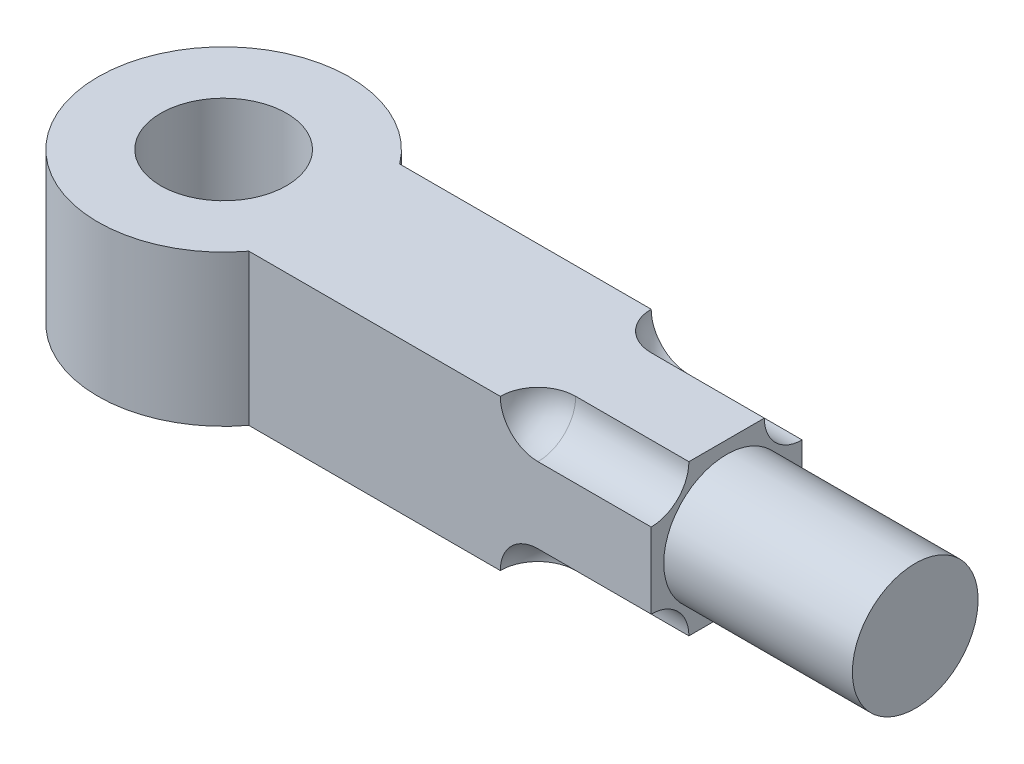
ISO-10303-21;
HEADER;
FILE_DESCRIPTION(('STEP AP214'),'2;1');
FILE_NAME('part.step','',(''),(''),'','','');
FILE_SCHEMA(('AUTOMOTIVE_DESIGN { 1 0 10303 214 1 1 1 1 }'));
ENDSEC;
DATA;
#1=APPLICATION_CONTEXT('core data for automotive mechanical design processes');
#2=APPLICATION_PROTOCOL_DEFINITION('international standard','automotive_design',2000,#1);
#3=PRODUCT_CONTEXT('',#1,'mechanical');
#4=PRODUCT('Part','Part','',(#3));
#5=PRODUCT_RELATED_PRODUCT_CATEGORY('part','',(#4));
#6=PRODUCT_DEFINITION_FORMATION('','',#4);
#7=PRODUCT_DEFINITION_CONTEXT('part definition',#1,'design');
#8=PRODUCT_DEFINITION('design','',#6,#7);
#9=PRODUCT_DEFINITION_SHAPE('','',#8);
#10=(LENGTH_UNIT() NAMED_UNIT(*) SI_UNIT(.MILLI.,.METRE.));
#11=(NAMED_UNIT(*) PLANE_ANGLE_UNIT() SI_UNIT($,.RADIAN.));
#12=(NAMED_UNIT(*) SI_UNIT($,.STERADIAN.) SOLID_ANGLE_UNIT());
#13=UNCERTAINTY_MEASURE_WITH_UNIT(LENGTH_MEASURE(1.E-05),#10,'distance_accuracy_value','');
#14=(GEOMETRIC_REPRESENTATION_CONTEXT(3) GLOBAL_UNCERTAINTY_ASSIGNED_CONTEXT((#13)) GLOBAL_UNIT_ASSIGNED_CONTEXT((#10,
#11,#12)) REPRESENTATION_CONTEXT('',''));
#15=CARTESIAN_POINT('',(0.,0.,0.));
#16=DIRECTION('',(0.,0.,1.));
#17=DIRECTION('',(1.,0.,0.));
#18=AXIS2_PLACEMENT_3D('',#15,#16,#17);
#19=CARTESIAN_POINT('',(-24.0000000000012,24.,11.9999999999971));
#20=DIRECTION('',(0.,0.,-0.999999999999995));
#21=DIRECTION('',(-0.999999999999995,0.,0.));
#22=AXIS2_PLACEMENT_3D('',#19,#20,#21);
#23=PLANE('',#22);
#24=DIRECTION('',(-0.999999999999995,0.,0.));
#25=VECTOR('',#24,1.);
#26=CARTESIAN_POINT('',(69.9999999999989,6.00000000000001,11.9999999999989));
#27=LINE('',#26,#25);
#28=CARTESIAN_POINT('',(40.0000000000001,6.00000000000001,11.9999999999891));
#29=VERTEX_POINT('',#28);
#30=CARTESIAN_POINT('',(21.9999999999992,6.00000000000001,12.0000000000087));
#31=VERTEX_POINT('',#30);
#32=EDGE_CURVE('E423',#29,#31,#27,.T.);
#33=ORIENTED_EDGE('',*,*,#32,.F.);
#34=DIRECTION('',(0.,-1.,0.));
#35=VECTOR('',#34,1.);
#36=CARTESIAN_POINT('',(40.0000000000001,24.,11.9999999999891));
#37=LINE('',#36,#35);
#38=CARTESIAN_POINT('',(40.0000000000001,18.,11.9999999999891));
#39=VERTEX_POINT('',#38);
#40=EDGE_CURVE('E379',#39,#29,#37,.T.);
#41=ORIENTED_EDGE('',*,*,#40,.F.);
#42=DIRECTION('',(-0.999999999999995,0.,0.));
#43=VECTOR('',#42,1.);
#44=CARTESIAN_POINT('',(69.9999999999989,18.,11.9999999999989));
#45=LINE('',#44,#43);
#46=CARTESIAN_POINT('',(21.9999999999992,18.,12.0000000000087));
#47=VERTEX_POINT('',#46);
#48=EDGE_CURVE('E418',#47,#39,#45,.F.);
#49=ORIENTED_EDGE('',*,*,#48,.F.);
#50=CARTESIAN_POINT('',(21.9999999999992,24.,12.0000000000087));
#51=DIRECTION('',(0.,0.,-0.999999999999995));
#52=DIRECTION('',(-0.999999999999995,0.,0.));
#53=AXIS2_PLACEMENT_3D('',#50,#51,#52);
#54=CIRCLE('',#53,6.);
#55=CARTESIAN_POINT('',(15.9999999999961,24.,11.9999999999956));
#56=VERTEX_POINT('',#55);
#57=EDGE_CURVE('E12',#47,#56,#54,.T.);
#58=ORIENTED_EDGE('',*,*,#57,.T.);
#59=DIRECTION('',(0.999999999999995,0.,0.));
#60=VECTOR('',#59,1.);
#61=CARTESIAN_POINT('',(-24.0000000000012,24.,11.9999999999971));
#62=LINE('',#61,#60);
#63=CARTESIAN_POINT('',(-24.0000000000012,24.,11.9999999999971));
#64=VERTEX_POINT('',#63);
#65=EDGE_CURVE('E387',#64,#56,#62,.T.);
#66=ORIENTED_EDGE('',*,*,#65,.F.);
#67=DIRECTION('',(0.,-1.,0.));
#68=VECTOR('',#67,1.);
#69=CARTESIAN_POINT('',(-24.0000000000012,24.,11.9999999999971));
#70=LINE('',#69,#68);
#71=CARTESIAN_POINT('',(-24.0000000000012,0.,11.9999999999971));
#72=VERTEX_POINT('',#71);
#73=EDGE_CURVE('E374',#64,#72,#70,.T.);
#74=ORIENTED_EDGE('',*,*,#73,.T.);
#75=DIRECTION('',(0.999999999999995,0.,0.));
#76=VECTOR('',#75,1.);
#77=CARTESIAN_POINT('',(-24.0000000000012,0.,11.9999999999971));
#78=LINE('',#77,#76);
#79=CARTESIAN_POINT('',(15.9999999999961,0.,11.9999999999956));
#80=VERTEX_POINT('',#79);
#81=EDGE_CURVE('E391',#72,#80,#78,.T.);
#82=ORIENTED_EDGE('',*,*,#81,.T.);
#83=CARTESIAN_POINT('',(21.9999999999992,0.,12.0000000000087));
#84=DIRECTION('',(0.,0.,-0.999999999999995));
#85=DIRECTION('',(-0.999999999999995,0.,0.));
#86=AXIS2_PLACEMENT_3D('',#83,#84,#85);
#87=CIRCLE('',#86,6.);
#88=EDGE_CURVE('E148',#80,#31,#87,.T.);
#89=ORIENTED_EDGE('',*,*,#88,.T.);
#90=EDGE_LOOP('',(#33,#41,#49,#58,#66,#74,#82,#89));
#91=FACE_BOUND('',#90,.T.);
#92=ADVANCED_FACE('F51',(#91),#23,.F.);
#93=CARTESIAN_POINT('',(-24.,24.,-11.9999999999998));
#94=DIRECTION('',(0.,0.,-0.999999999999995));
#95=DIRECTION('',(-0.999999999999995,0.,0.));
#96=AXIS2_PLACEMENT_3D('',#93,#94,#95);
#97=PLANE('',#96);
#98=DIRECTION('',(0.,-1.,0.));
#99=VECTOR('',#98,1.);
#100=CARTESIAN_POINT('',(39.9999999999972,24.,-11.9999999999978));
#101=LINE('',#100,#99);
#102=CARTESIAN_POINT('',(39.9999999999972,18.0000000000001,-11.9999999999978));
#103=VERTEX_POINT('',#102);
#104=CARTESIAN_POINT('',(39.9999999999972,5.99999999999989,-11.9999999999978));
#105=VERTEX_POINT('',#104);
#106=EDGE_CURVE('E401',#103,#105,#101,.T.);
#107=ORIENTED_EDGE('',*,*,#106,.T.);
#108=DIRECTION('',(-0.999999999999995,0.,0.));
#109=VECTOR('',#108,1.);
#110=CARTESIAN_POINT('',(69.9999999999986,5.99999999999989,-12.0000000000025));
#111=LINE('',#110,#109);
#112=CARTESIAN_POINT('',(22.0000000000005,5.99999999999989,-12.0000000000011));
#113=VERTEX_POINT('',#112);
#114=EDGE_CURVE('E144',#105,#113,#111,.T.);
#115=ORIENTED_EDGE('',*,*,#114,.T.);
#116=CARTESIAN_POINT('',(22.0000000000005,-1.11022302462516E-13,-12.0000000000011));
#117=DIRECTION('',(0.,0.,-0.999999999999995));
#118=DIRECTION('',(-0.999999999999995,0.,0.));
#119=AXIS2_PLACEMENT_3D('',#116,#117,#118);
#120=CIRCLE('',#119,6.);
#121=CARTESIAN_POINT('',(16.0000000000015,0.,-12.0000000000011));
#122=VERTEX_POINT('',#121);
#123=EDGE_CURVE('E140',#113,#122,#120,.F.);
#124=ORIENTED_EDGE('',*,*,#123,.T.);
#125=DIRECTION('',(0.999999999999995,0.,0.));
#126=VECTOR('',#125,1.);
#127=CARTESIAN_POINT('',(-24.,0.,-11.9999999999998));
#128=LINE('',#127,#126);
#129=CARTESIAN_POINT('',(-24.,0.,-11.9999999999998));
#130=VERTEX_POINT('',#129);
#131=EDGE_CURVE('E141',#130,#122,#128,.T.);
#132=ORIENTED_EDGE('',*,*,#131,.F.);
#133=DIRECTION('',(0.,-1.,0.));
#134=VECTOR('',#133,1.);
#135=CARTESIAN_POINT('',(-24.,24.,-11.9999999999998));
#136=LINE('',#135,#134);
#137=CARTESIAN_POINT('',(-24.,24.,-11.9999999999998));
#138=VERTEX_POINT('',#137);
#139=EDGE_CURVE('E210',#138,#130,#136,.T.);
#140=ORIENTED_EDGE('',*,*,#139,.F.);
#141=DIRECTION('',(0.999999999999995,0.,0.));
#142=VECTOR('',#141,1.);
#143=CARTESIAN_POINT('',(-24.,24.,-11.9999999999998));
#144=LINE('',#143,#142);
#145=CARTESIAN_POINT('',(16.0000000000015,24.,-12.0000000000011));
#146=VERTEX_POINT('',#145);
#147=EDGE_CURVE('E198',#138,#146,#144,.T.);
#148=ORIENTED_EDGE('',*,*,#147,.T.);
#149=CARTESIAN_POINT('',(22.0000000000005,24.0000000000001,-12.0000000000011));
#150=DIRECTION('',(0.,0.,-0.999999999999995));
#151=DIRECTION('',(-0.999999999999995,0.,0.));
#152=AXIS2_PLACEMENT_3D('',#149,#150,#151);
#153=CIRCLE('',#152,6.);
#154=CARTESIAN_POINT('',(22.0000000000005,18.0000000000001,-12.0000000000011));
#155=VERTEX_POINT('',#154);
#156=EDGE_CURVE('E181',#146,#155,#153,.F.);
#157=ORIENTED_EDGE('',*,*,#156,.T.);
#158=DIRECTION('',(-0.999999999999995,0.,0.));
#159=VECTOR('',#158,1.);
#160=CARTESIAN_POINT('',(69.9999999999986,18.0000000000001,-12.0000000000025));
#161=LINE('',#160,#159);
#162=EDGE_CURVE('E437',#155,#103,#161,.F.);
#163=ORIENTED_EDGE('',*,*,#162,.T.);
#164=EDGE_LOOP('',(#107,#115,#124,#132,#140,#148,#157,#163));
#165=FACE_BOUND('',#164,.T.);
#166=ADVANCED_FACE('F145',(#165),#97,.T.);
#167=CARTESIAN_POINT('',(-39.9999999999973,24.,3.5527136788005E-12));
#168=DIRECTION('',(0.,1.,0.));
#169=DIRECTION('',(0.,0.,0.999999999999995));
#170=AXIS2_PLACEMENT_3D('',#167,#168,#169);
#171=PLANE('',#170);
#172=CARTESIAN_POINT('',(-39.9999999999973,24.000012,3.5527136788005E-12));
#173=DIRECTION('',(0.,1.,0.));
#174=DIRECTION('',(0.,0.,1.));
#175=AXIS2_PLACEMENT_3D('',#172,#173,#174);
#176=CIRCLE('',#175,9.99999999999995);
#177=CARTESIAN_POINT('',(-39.9999999999973,24.000012,10.0000000000035));
#178=VERTEX_POINT('',#177);
#179=EDGE_CURVE('E445',#178,#178,#176,.T.);
#180=ORIENTED_EDGE('',*,*,#179,.F.);
#181=EDGE_LOOP('',(#180));
#182=FACE_BOUND('',#181,.T.);
#183=DIRECTION('',(0.,0.,0.999999999999995));
#184=VECTOR('',#183,1.);
#185=CARTESIAN_POINT('',(39.9999999999972,24.,-11.9999999999978));
#186=LINE('',#185,#184);
#187=CARTESIAN_POINT('',(39.9999999999976,24.,-6.00000000000711));
#188=VERTEX_POINT('',#187);
#189=CARTESIAN_POINT('',(40.,24.,6.00000000000001));
#190=VERTEX_POINT('',#189);
#191=EDGE_CURVE('E208',#188,#190,#186,.T.);
#192=ORIENTED_EDGE('',*,*,#191,.F.);
#193=DIRECTION('',(-0.999999999999995,0.,0.));
#194=VECTOR('',#193,1.);
#195=CARTESIAN_POINT('',(69.9999999999984,24.,-6.00000000000001));
#196=LINE('',#195,#194);
#197=CARTESIAN_POINT('',(21.9999999999999,24.,-6.00000000000001));
#198=VERTEX_POINT('',#197);
#199=EDGE_CURVE('E203',#188,#198,#196,.T.);
#200=ORIENTED_EDGE('',*,*,#199,.T.);
#201=CARTESIAN_POINT('',(22.0000000000006,24.,-12.0000000000009));
#202=DIRECTION('',(0.,1.,0.));
#203=DIRECTION('',(0.,0.,0.999999999999995));
#204=AXIS2_PLACEMENT_3D('',#201,#202,#203);
#205=CIRCLE('',#204,6.);
#206=EDGE_CURVE('E183',#198,#146,#205,.F.);
#207=ORIENTED_EDGE('',*,*,#206,.T.);
#208=ORIENTED_EDGE('',*,*,#147,.F.);
#209=CARTESIAN_POINT('',(-39.9999999999973,24.,3.5527136788005E-12));
#210=DIRECTION('',(0.,1.,0.));
#211=DIRECTION('',(0.,0.,0.999999999999995));
#212=AXIS2_PLACEMENT_3D('',#209,#210,#211);
#213=CIRCLE('',#212,20.);
#214=EDGE_CURVE('E162',#138,#64,#213,.T.);
#215=ORIENTED_EDGE('',*,*,#214,.T.);
#216=ORIENTED_EDGE('',*,*,#65,.T.);
#217=CARTESIAN_POINT('',(21.9999999999992,24.,12.0000000000087));
#218=DIRECTION('',(0.,1.,0.));
#219=DIRECTION('',(0.,0.,0.999999999999995));
#220=AXIS2_PLACEMENT_3D('',#217,#218,#219);
#221=CIRCLE('',#220,6.);
#222=CARTESIAN_POINT('',(22.,24.,6.00000000000001));
#223=VERTEX_POINT('',#222);
#224=EDGE_CURVE('E58',#56,#223,#221,.F.);
#225=ORIENTED_EDGE('',*,*,#224,.T.);
#226=DIRECTION('',(-0.999999999999995,0.,0.));
#227=VECTOR('',#226,1.);
#228=CARTESIAN_POINT('',(69.9999999999984,24.,6.00000000000001));
#229=LINE('',#228,#227);
#230=EDGE_CURVE('E224',#223,#190,#229,.F.);
#231=ORIENTED_EDGE('',*,*,#230,.T.);
#232=EDGE_LOOP('',(#192,#200,#207,#208,#215,#216,#225,#231));
#233=FACE_BOUND('',#232,.T.);
#234=ADVANCED_FACE('F199',(#182,#233),#171,.T.);
#235=CARTESIAN_POINT('',(-39.9999999999973,0.,3.5527136788005E-12));
#236=DIRECTION('',(0.,1.,0.));
#237=DIRECTION('',(0.,0.,0.999999999999995));
#238=AXIS2_PLACEMENT_3D('',#235,#236,#237);
#239=PLANE('',#238);
#240=CARTESIAN_POINT('',(-39.9999999999973,0.,3.5527136788005E-12));
#241=DIRECTION('',(0.,1.,0.));
#242=DIRECTION('',(0.,0.,0.999999999999995));
#243=AXIS2_PLACEMENT_3D('',#240,#241,#242);
#244=CIRCLE('',#243,10.);
#245=CARTESIAN_POINT('',(-39.9999999999973,0.,10.0000000000035));
#246=VERTEX_POINT('',#245);
#247=EDGE_CURVE('E442',#246,#246,#244,.T.);
#248=ORIENTED_EDGE('',*,*,#247,.T.);
#249=EDGE_LOOP('',(#248));
#250=FACE_BOUND('',#249,.T.);
#251=DIRECTION('',(-0.999999999999995,0.,0.));
#252=VECTOR('',#251,1.);
#253=CARTESIAN_POINT('',(69.9999999999984,0.,6.00000000000001));
#254=LINE('',#253,#252);
#255=CARTESIAN_POINT('',(22.,0.,6.00000000000001));
#256=VERTEX_POINT('',#255);
#257=CARTESIAN_POINT('',(40.,0.,6.00000000000001));
#258=VERTEX_POINT('',#257);
#259=EDGE_CURVE('E226',#256,#258,#254,.F.);
#260=ORIENTED_EDGE('',*,*,#259,.F.);
#261=CARTESIAN_POINT('',(21.9999999999992,0.,12.0000000000087));
#262=DIRECTION('',(0.,1.,0.));
#263=DIRECTION('',(0.,0.,0.999999999999995));
#264=AXIS2_PLACEMENT_3D('',#261,#262,#263);
#265=CIRCLE('',#264,6.);
#266=EDGE_CURVE('E178',#256,#80,#265,.T.);
#267=ORIENTED_EDGE('',*,*,#266,.T.);
#268=ORIENTED_EDGE('',*,*,#81,.F.);
#269=CARTESIAN_POINT('',(-39.9999999999973,0.,3.5527136788005E-12));
#270=DIRECTION('',(0.,1.,0.));
#271=DIRECTION('',(0.,0.,0.999999999999995));
#272=AXIS2_PLACEMENT_3D('',#269,#270,#271);
#273=CIRCLE('',#272,20.);
#274=EDGE_CURVE('E159',#130,#72,#273,.T.);
#275=ORIENTED_EDGE('',*,*,#274,.F.);
#276=ORIENTED_EDGE('',*,*,#131,.T.);
#277=CARTESIAN_POINT('',(22.0000000000006,0.,-12.0000000000009));
#278=DIRECTION('',(0.,1.,0.));
#279=DIRECTION('',(0.,0.,0.999999999999995));
#280=AXIS2_PLACEMENT_3D('',#277,#278,#279);
#281=CIRCLE('',#280,6.);
#282=CARTESIAN_POINT('',(21.9999999999999,0.,-6.00000000000001));
#283=VERTEX_POINT('',#282);
#284=EDGE_CURVE('E152',#122,#283,#281,.T.);
#285=ORIENTED_EDGE('',*,*,#284,.T.);
#286=DIRECTION('',(-0.999999999999995,0.,0.));
#287=VECTOR('',#286,1.);
#288=CARTESIAN_POINT('',(69.9999999999984,0.,-6.00000000000001));
#289=LINE('',#288,#287);
#290=CARTESIAN_POINT('',(39.9999999999976,0.,-6.00000000000711));
#291=VERTEX_POINT('',#290);
#292=EDGE_CURVE('E233',#291,#283,#289,.T.);
#293=ORIENTED_EDGE('',*,*,#292,.F.);
#294=DIRECTION('',(0.,0.,0.999999999999995));
#295=VECTOR('',#294,1.);
#296=CARTESIAN_POINT('',(39.9999999999972,0.,-11.9999999999978));
#297=LINE('',#296,#295);
#298=EDGE_CURVE('E161',#291,#258,#297,.T.);
#299=ORIENTED_EDGE('',*,*,#298,.T.);
#300=EDGE_LOOP('',(#260,#267,#268,#275,#276,#285,#293,#299));
#301=FACE_BOUND('',#300,.T.);
#302=ADVANCED_FACE('F156',(#250,#301),#239,.F.);
#303=CARTESIAN_POINT('',(-39.9999999999973,24.,3.5527136788005E-12));
#304=DIRECTION('',(0.,-1.,0.));
#305=DIRECTION('',(0.,0.,-0.999999999999995));
#306=AXIS2_PLACEMENT_3D('',#303,#304,#305);
#307=CYLINDRICAL_SURFACE('',#306,20.);
#308=ORIENTED_EDGE('',*,*,#274,.T.);
#309=ORIENTED_EDGE('',*,*,#73,.F.);
#310=ORIENTED_EDGE('',*,*,#214,.F.);
#311=ORIENTED_EDGE('',*,*,#139,.T.);
#312=EDGE_LOOP('',(#308,#309,#310,#311));
#313=FACE_BOUND('',#312,.T.);
#314=ADVANCED_FACE('F253',(#313),#307,.T.);
#315=CARTESIAN_POINT('',(39.9999999999972,24.,-11.9999999999978));
#316=DIRECTION('',(0.999999999999995,0.,0.));
#317=DIRECTION('',(0.,0.,-0.999999999999995));
#318=AXIS2_PLACEMENT_3D('',#315,#316,#317);
#319=PLANE('',#318);
#320=CARTESIAN_POINT('',(39.9999999999997,12.,-3.33066907387547E-12));
#321=DIRECTION('',(0.999999999999995,0.,0.));
#322=DIRECTION('',(0.,0.,-0.999999999999995));
#323=AXIS2_PLACEMENT_3D('',#320,#321,#322);
#324=CIRCLE('',#323,10.);
#325=CARTESIAN_POINT('',(39.9999999999997,12.,9.99999999999706));
#326=VERTEX_POINT('',#325);
#327=EDGE_CURVE('E234',#326,#326,#324,.T.);
#328=ORIENTED_EDGE('',*,*,#327,.F.);
#329=EDGE_LOOP('',(#328));
#330=FACE_BOUND('',#329,.T.);
#331=ORIENTED_EDGE('',*,*,#40,.T.);
#332=CARTESIAN_POINT('',(40.0000000000001,0.,11.9999999999891));
#333=DIRECTION('',(0.999999999999995,0.,0.));
#334=DIRECTION('',(0.,0.,-0.999999999999995));
#335=AXIS2_PLACEMENT_3D('',#332,#333,#334);
#336=CIRCLE('',#335,6.);
#337=EDGE_CURVE('E411',#29,#258,#336,.F.);
#338=ORIENTED_EDGE('',*,*,#337,.T.);
#339=ORIENTED_EDGE('',*,*,#298,.F.);
#340=CARTESIAN_POINT('',(39.9999999999972,-1.11022302462516E-13,-11.9999999999978));
#341=DIRECTION('',(0.999999999999995,0.,0.));
#342=DIRECTION('',(0.,0.,-0.999999999999995));
#343=AXIS2_PLACEMENT_3D('',#340,#341,#342);
#344=CIRCLE('',#343,6.);
#345=EDGE_CURVE('E478',#291,#105,#344,.F.);
#346=ORIENTED_EDGE('',*,*,#345,.T.);
#347=ORIENTED_EDGE('',*,*,#106,.F.);
#348=CARTESIAN_POINT('',(39.9999999999972,24.0000000000001,-11.9999999999978));
#349=DIRECTION('',(0.999999999999995,0.,0.));
#350=DIRECTION('',(0.,0.,-0.999999999999995));
#351=AXIS2_PLACEMENT_3D('',#348,#349,#350);
#352=CIRCLE('',#351,6.);
#353=EDGE_CURVE('E434',#103,#188,#352,.F.);
#354=ORIENTED_EDGE('',*,*,#353,.T.);
#355=ORIENTED_EDGE('',*,*,#191,.T.);
#356=CARTESIAN_POINT('',(40.0000000000001,24.,11.9999999999891));
#357=DIRECTION('',(0.999999999999995,0.,0.));
#358=DIRECTION('',(0.,0.,-0.999999999999995));
#359=AXIS2_PLACEMENT_3D('',#356,#357,#358);
#360=CIRCLE('',#359,6.);
#361=EDGE_CURVE('E416',#190,#39,#360,.F.);
#362=ORIENTED_EDGE('',*,*,#361,.T.);
#363=EDGE_LOOP('',(#331,#338,#339,#346,#347,#354,#355,#362));
#364=FACE_BOUND('',#363,.T.);
#365=ADVANCED_FACE('F256',(#330,#364),#319,.T.);
#366=CARTESIAN_POINT('',(69.9999999999991,12.,-2.88657986402541E-12));
#367=DIRECTION('',(-0.999999999999995,0.,0.));
#368=DIRECTION('',(0.,0.,0.999999999999995));
#369=AXIS2_PLACEMENT_3D('',#366,#367,#368);
#370=CYLINDRICAL_SURFACE('',#369,10.);
#371=CARTESIAN_POINT('',(69.9999999999991,12.,-2.88657986402541E-12));
#372=DIRECTION('',(0.999999999999995,0.,0.));
#373=DIRECTION('',(0.,0.,-0.999999999999995));
#374=AXIS2_PLACEMENT_3D('',#371,#372,#373);
#375=CIRCLE('',#374,10.);
#376=CARTESIAN_POINT('',(69.9999999999991,12.,9.99999999999706));
#377=VERTEX_POINT('',#376);
#378=EDGE_CURVE('E371',#377,#377,#375,.T.);
#379=CARTESIAN_POINT('',(69.9999999999991,12.,9.99999999999706));
#380=CARTESIAN_POINT('',(69.6874999999991,12.,9.99999999999706));
#381=CARTESIAN_POINT('',(69.3749999999991,12.,9.99999999999706));
#382=CARTESIAN_POINT('',(68.7499999999991,12.,9.99999999999706));
#383=CARTESIAN_POINT('',(68.4374999999991,12.,9.99999999999706));
#384=CARTESIAN_POINT('',(67.8124999999991,12.,9.99999999999706));
#385=CARTESIAN_POINT('',(67.4999999999991,12.,9.99999999999706));
#386=CARTESIAN_POINT('',(66.8749999999991,12.,9.99999999999706));
#387=CARTESIAN_POINT('',(66.5624999999991,12.,9.99999999999706));
#388=CARTESIAN_POINT('',(65.9374999999991,12.,9.99999999999706));
#389=CARTESIAN_POINT('',(65.6249999999992,12.,9.99999999999706));
#390=CARTESIAN_POINT('',(64.9999999999992,12.,9.99999999999706));
#391=CARTESIAN_POINT('',(64.6874999999992,12.,9.99999999999706));
#392=CARTESIAN_POINT('',(64.0624999999992,12.,9.99999999999706));
#393=CARTESIAN_POINT('',(63.7499999999992,12.,9.99999999999706));
#394=CARTESIAN_POINT('',(63.1249999999992,12.,9.99999999999706));
#395=CARTESIAN_POINT('',(62.8124999999992,12.,9.99999999999706));
#396=CARTESIAN_POINT('',(62.1874999999992,12.,9.99999999999706));
#397=CARTESIAN_POINT('',(61.8749999999992,12.,9.99999999999706));
#398=CARTESIAN_POINT('',(61.2499999999992,12.,9.99999999999706));
#399=CARTESIAN_POINT('',(60.9374999999992,12.,9.99999999999706));
#400=CARTESIAN_POINT('',(60.3124999999993,12.,9.99999999999706));
#401=CARTESIAN_POINT('',(59.9999999999993,12.,9.99999999999706));
#402=CARTESIAN_POINT('',(59.3749999999993,12.,9.99999999999706));
#403=CARTESIAN_POINT('',(59.0624999999993,12.,9.99999999999706));
#404=CARTESIAN_POINT('',(58.4374999999993,12.,9.99999999999706));
#405=CARTESIAN_POINT('',(58.1249999999993,12.,9.99999999999706));
#406=CARTESIAN_POINT('',(57.4999999999993,12.,9.99999999999706));
#407=CARTESIAN_POINT('',(57.1874999999993,12.,9.99999999999706));
#408=CARTESIAN_POINT('',(56.5624999999993,12.,9.99999999999706));
#409=CARTESIAN_POINT('',(56.2499999999993,12.,9.99999999999706));
#410=CARTESIAN_POINT('',(55.6249999999994,12.,9.99999999999706));
#411=CARTESIAN_POINT('',(55.3124999999994,12.,9.99999999999706));
#412=CARTESIAN_POINT('',(54.6874999999994,12.,9.99999999999706));
#413=CARTESIAN_POINT('',(54.3749999999994,12.,9.99999999999706));
#414=CARTESIAN_POINT('',(53.7499999999994,12.,9.99999999999706));
#415=CARTESIAN_POINT('',(53.4374999999994,12.,9.99999999999706));
#416=CARTESIAN_POINT('',(52.8124999999994,12.,9.99999999999706));
#417=CARTESIAN_POINT('',(52.4999999999994,12.,9.99999999999706));
#418=CARTESIAN_POINT('',(51.8749999999994,12.,9.99999999999706));
#419=CARTESIAN_POINT('',(51.5624999999994,12.,9.99999999999706));
#420=CARTESIAN_POINT('',(50.9374999999995,12.,9.99999999999706));
#421=CARTESIAN_POINT('',(50.6249999999995,12.,9.99999999999706));
#422=CARTESIAN_POINT('',(49.9999999999995,12.,9.99999999999706));
#423=CARTESIAN_POINT('',(49.6874999999995,12.,9.99999999999706));
#424=CARTESIAN_POINT('',(49.0624999999995,12.,9.99999999999706));
#425=CARTESIAN_POINT('',(48.7499999999995,12.,9.99999999999706));
#426=CARTESIAN_POINT('',(48.1249999999995,12.,9.99999999999706));
#427=CARTESIAN_POINT('',(47.8124999999995,12.,9.99999999999706));
#428=CARTESIAN_POINT('',(47.1874999999996,12.,9.99999999999706));
#429=CARTESIAN_POINT('',(46.8749999999996,12.,9.99999999999706));
#430=CARTESIAN_POINT('',(46.2499999999996,12.,9.99999999999706));
#431=CARTESIAN_POINT('',(45.9374999999996,12.,9.99999999999706));
#432=CARTESIAN_POINT('',(45.3124999999996,12.,9.99999999999706));
#433=CARTESIAN_POINT('',(44.9999999999996,12.,9.99999999999706));
#434=CARTESIAN_POINT('',(44.3749999999996,12.,9.99999999999706));
#435=CARTESIAN_POINT('',(44.0624999999996,12.,9.99999999999706));
#436=CARTESIAN_POINT('',(43.4374999999996,12.,9.99999999999706));
#437=CARTESIAN_POINT('',(43.1249999999996,12.,9.99999999999706));
#438=CARTESIAN_POINT('',(42.4999999999997,12.,9.99999999999706));
#439=CARTESIAN_POINT('',(42.1874999999997,12.,9.99999999999706));
#440=CARTESIAN_POINT('',(41.5624999999997,12.,9.99999999999706));
#441=CARTESIAN_POINT('',(41.2499999999997,12.,9.99999999999706));
#442=CARTESIAN_POINT('',(40.6249999999997,12.,9.99999999999706));
#443=CARTESIAN_POINT('',(40.3124999999997,12.,9.99999999999706));
#444=CARTESIAN_POINT('',(39.9999999999997,12.,9.99999999999706));
#445=B_SPLINE_CURVE_WITH_KNOTS('',3,(#379,#380,#381,#382,#383,#384,#385,#386,#387,#388,#389,
#390,#391,#392,#393,#394,#395,#396,#397,#398,#399,#400,#401,#402,#403,#404,#405,#406,#407,#408,
#409,#410,#411,#412,#413,#414,#415,#416,#417,#418,#419,#420,#421,#422,#423,#424,#425,#426,#427,
#428,#429,#430,#431,#432,#433,#434,#435,#436,#437,#438,#439,#440,#441,#442,#443,#444),
.UNSPECIFIED.,.F.,.F.,(4,2,2,2,2,2,2,2,2,2,2,2,2,2,2,2,2,2,2,2,2,2,2,2,2,2,2,2,2,2,2,2,4),(0.,
0.93749999999998,1.87499999999996,2.81249999999994,3.74999999999992,4.6874999999999,
5.62499999999988,6.56249999999986,7.49999999999985,8.43749999999983,9.37499999999981,
10.3124999999998,11.2499999999998,12.1874999999997,13.1249999999997,14.0624999999997,
14.9999999999997,15.9374999999997,16.8749999999996,17.8124999999996,18.7499999999996,
19.6874999999996,20.6249999999996,21.5624999999995,22.4999999999995,23.4374999999995,
24.3749999999995,25.3124999999995,26.2499999999994,27.1874999999994,28.1249999999994,
29.0624999999994,29.9999999999994),.UNSPECIFIED.);
#446=EDGE_CURVE('BSEAM252',#377,#326,#445,.T.);
#447=ORIENTED_EDGE('',*,*,#378,.F.);
#448=ORIENTED_EDGE('',*,*,#327,.T.);
#449=ORIENTED_EDGE('',*,*,#446,.T.);
#450=ORIENTED_EDGE('',*,*,#446,.F.);
#451=EDGE_LOOP('',(#447,#449,#448,#450));
#452=FACE_BOUND('',#451,.T.);
#453=ADVANCED_FACE('F252',(#452),#370,.T.);
#454=CARTESIAN_POINT('',(69.9999999999991,12.,-2.88657986402541E-12));
#455=DIRECTION('',(0.999999999999995,0.,0.));
#456=DIRECTION('',(0.,0.,-0.999999999999995));
#457=AXIS2_PLACEMENT_3D('',#454,#455,#456);
#458=PLANE('',#457);
#459=ORIENTED_EDGE('',*,*,#378,.T.);
#460=EDGE_LOOP('',(#459));
#461=FACE_BOUND('',#460,.T.);
#462=ADVANCED_FACE('F341',(#461),#458,.T.);
#463=CARTESIAN_POINT('',(-39.9999999999973,0.,3.5527136788005E-12));
#464=DIRECTION('',(0.,1.,0.));
#465=DIRECTION('',(0.,0.,0.999999999999995));
#466=AXIS2_PLACEMENT_3D('',#463,#464,#465);
#467=CYLINDRICAL_SURFACE('',#466,10.);
#468=ORIENTED_EDGE('',*,*,#247,.F.);
#469=EDGE_LOOP('',(#468));
#470=FACE_BOUND('',#469,.T.);
#471=ORIENTED_EDGE('',*,*,#179,.T.);
#472=EDGE_LOOP('',(#471));
#473=FACE_BOUND('',#472,.T.);
#474=ADVANCED_FACE('F318',(#470,#473),#467,.F.);
#475=CARTESIAN_POINT('',(69.9999999999987,-1.11022302462516E-13,-12.0000000000025));
#476=DIRECTION('',(-0.999999999999995,0.,0.));
#477=DIRECTION('',(0.,0.,0.999999999999995));
#478=AXIS2_PLACEMENT_3D('',#475,#476,#477);
#479=CYLINDRICAL_SURFACE('',#478,6.);
#480=ORIENTED_EDGE('',*,*,#292,.T.);
#481=CARTESIAN_POINT('',(22.0000000000006,-1.11022302462516E-13,-12.0000000000009));
#482=DIRECTION('',(-0.999999999999995,0.,0.));
#483=DIRECTION('',(0.,0.,0.999999999999995));
#484=AXIS2_PLACEMENT_3D('',#481,#482,#483);
#485=CIRCLE('',#484,6.);
#486=EDGE_CURVE('E168',#283,#113,#485,.T.);
#487=ORIENTED_EDGE('',*,*,#486,.T.);
#488=ORIENTED_EDGE('',*,*,#114,.F.);
#489=ORIENTED_EDGE('',*,*,#345,.F.);
#490=EDGE_LOOP('',(#480,#487,#488,#489));
#491=FACE_BOUND('',#490,.T.);
#492=ADVANCED_FACE('F315',(#491),#479,.F.);
#493=CARTESIAN_POINT('',(69.9999999999989,0.,11.9999999999989));
#494=DIRECTION('',(-0.999999999999995,0.,0.));
#495=DIRECTION('',(0.,0.,0.999999999999995));
#496=AXIS2_PLACEMENT_3D('',#493,#494,#495);
#497=CYLINDRICAL_SURFACE('',#496,6.);
#498=ORIENTED_EDGE('',*,*,#32,.T.);
#499=CARTESIAN_POINT('',(21.9999999999992,0.,12.0000000000087));
#500=DIRECTION('',(-0.999999999999995,0.,0.));
#501=DIRECTION('',(0.,0.,0.999999999999995));
#502=AXIS2_PLACEMENT_3D('',#499,#500,#501);
#503=CIRCLE('',#502,6.);
#504=EDGE_CURVE('E213',#31,#256,#503,.T.);
#505=ORIENTED_EDGE('',*,*,#504,.T.);
#506=ORIENTED_EDGE('',*,*,#259,.T.);
#507=ORIENTED_EDGE('',*,*,#337,.F.);
#508=EDGE_LOOP('',(#498,#505,#506,#507));
#509=FACE_BOUND('',#508,.T.);
#510=ADVANCED_FACE('F302',(#509),#497,.F.);
#511=CARTESIAN_POINT('',(69.9999999999989,24.,11.9999999999989));
#512=DIRECTION('',(-0.999999999999995,0.,0.));
#513=DIRECTION('',(0.,0.,0.999999999999995));
#514=AXIS2_PLACEMENT_3D('',#511,#512,#513);
#515=CYLINDRICAL_SURFACE('',#514,6.);
#516=ORIENTED_EDGE('',*,*,#230,.F.);
#517=CARTESIAN_POINT('',(21.9999999999992,24.,12.0000000000087));
#518=DIRECTION('',(-0.999999999999995,0.,0.));
#519=DIRECTION('',(0.,0.,0.999999999999995));
#520=AXIS2_PLACEMENT_3D('',#517,#518,#519);
#521=CIRCLE('',#520,6.);
#522=EDGE_CURVE('E166',#223,#47,#521,.T.);
#523=ORIENTED_EDGE('',*,*,#522,.T.);
#524=ORIENTED_EDGE('',*,*,#48,.T.);
#525=ORIENTED_EDGE('',*,*,#361,.F.);
#526=EDGE_LOOP('',(#516,#523,#524,#525));
#527=FACE_BOUND('',#526,.T.);
#528=ADVANCED_FACE('F300',(#527),#515,.F.);
#529=CARTESIAN_POINT('',(69.9999999999987,24.0000000000001,-12.0000000000025));
#530=DIRECTION('',(-0.999999999999995,0.,0.));
#531=DIRECTION('',(0.,0.,0.999999999999995));
#532=AXIS2_PLACEMENT_3D('',#529,#530,#531);
#533=CYLINDRICAL_SURFACE('',#532,6.);
#534=ORIENTED_EDGE('',*,*,#162,.F.);
#535=CARTESIAN_POINT('',(22.0000000000006,24.0000000000001,-12.0000000000009));
#536=DIRECTION('',(-0.999999999999995,0.,0.));
#537=DIRECTION('',(0.,0.,0.999999999999995));
#538=AXIS2_PLACEMENT_3D('',#535,#536,#537);
#539=CIRCLE('',#538,6.);
#540=EDGE_CURVE('E175',#155,#198,#539,.T.);
#541=ORIENTED_EDGE('',*,*,#540,.T.);
#542=ORIENTED_EDGE('',*,*,#199,.F.);
#543=ORIENTED_EDGE('',*,*,#353,.F.);
#544=EDGE_LOOP('',(#534,#541,#542,#543));
#545=FACE_BOUND('',#544,.T.);
#546=ADVANCED_FACE('F275',(#545),#533,.F.);
#547=CARTESIAN_POINT('',(22.0000000000006,-1.11022302462516E-13,-12.0000000000009));
#548=DIRECTION('',(0.999999999999995,0.,0.));
#549=DIRECTION('',(0.,0.,-0.999999999999995));
#550=AXIS2_PLACEMENT_3D('',#547,#548,#549);
#551=SPHERICAL_SURFACE('',#550,6.);
#552=ORIENTED_EDGE('',*,*,#123,.F.);
#553=ORIENTED_EDGE('',*,*,#486,.F.);
#554=ORIENTED_EDGE('',*,*,#284,.F.);
#555=EDGE_LOOP('',(#552,#553,#554));
#556=FACE_BOUND('',#555,.T.);
#557=ADVANCED_FACE('F164',(#556),#551,.F.);
#558=CARTESIAN_POINT('',(21.9999999999992,0.,12.0000000000087));
#559=DIRECTION('',(-0.999999999999995,0.,0.));
#560=DIRECTION('',(0.,0.,0.999999999999995));
#561=AXIS2_PLACEMENT_3D('',#558,#559,#560);
#562=SPHERICAL_SURFACE('',#561,6.);
#563=ORIENTED_EDGE('',*,*,#266,.F.);
#564=ORIENTED_EDGE('',*,*,#504,.F.);
#565=ORIENTED_EDGE('',*,*,#88,.F.);
#566=EDGE_LOOP('',(#563,#564,#565));
#567=FACE_BOUND('',#566,.T.);
#568=ADVANCED_FACE('F272',(#567),#562,.F.);
#569=CARTESIAN_POINT('',(22.0000000000006,24.0000000000001,-12.0000000000009));
#570=DIRECTION('',(-0.999999999999995,0.,0.));
#571=DIRECTION('',(0.,0.,0.999999999999995));
#572=AXIS2_PLACEMENT_3D('',#569,#570,#571);
#573=SPHERICAL_SURFACE('',#572,6.);
#574=ORIENTED_EDGE('',*,*,#206,.F.);
#575=ORIENTED_EDGE('',*,*,#540,.F.);
#576=ORIENTED_EDGE('',*,*,#156,.F.);
#577=EDGE_LOOP('',(#574,#575,#576));
#578=FACE_BOUND('',#577,.T.);
#579=ADVANCED_FACE('F215',(#578),#573,.F.);
#580=CARTESIAN_POINT('',(21.9999999999992,24.,12.0000000000087));
#581=DIRECTION('',(0.999999999999995,0.,0.));
#582=DIRECTION('',(0.,0.,-0.999999999999995));
#583=AXIS2_PLACEMENT_3D('',#580,#581,#582);
#584=SPHERICAL_SURFACE('',#583,6.);
#585=ORIENTED_EDGE('',*,*,#57,.F.);
#586=ORIENTED_EDGE('',*,*,#522,.F.);
#587=ORIENTED_EDGE('',*,*,#224,.F.);
#588=EDGE_LOOP('',(#585,#586,#587));
#589=FACE_BOUND('',#588,.T.);
#590=ADVANCED_FACE('F52',(#589),#584,.F.);
#591=CLOSED_SHELL('',(#92,#166,#234,#302,#314,#365,#453,#462,#474,#492,#510,#528,#546,#557,#568,
#579,#590));
#592=MANIFOLD_SOLID_BREP('B2',#591);
#593=ADVANCED_BREP_SHAPE_REPRESENTATION('',(#18,#592),#14);
#594=SHAPE_DEFINITION_REPRESENTATION(#9,#593);
ENDSEC;
END-ISO-10303-21;
